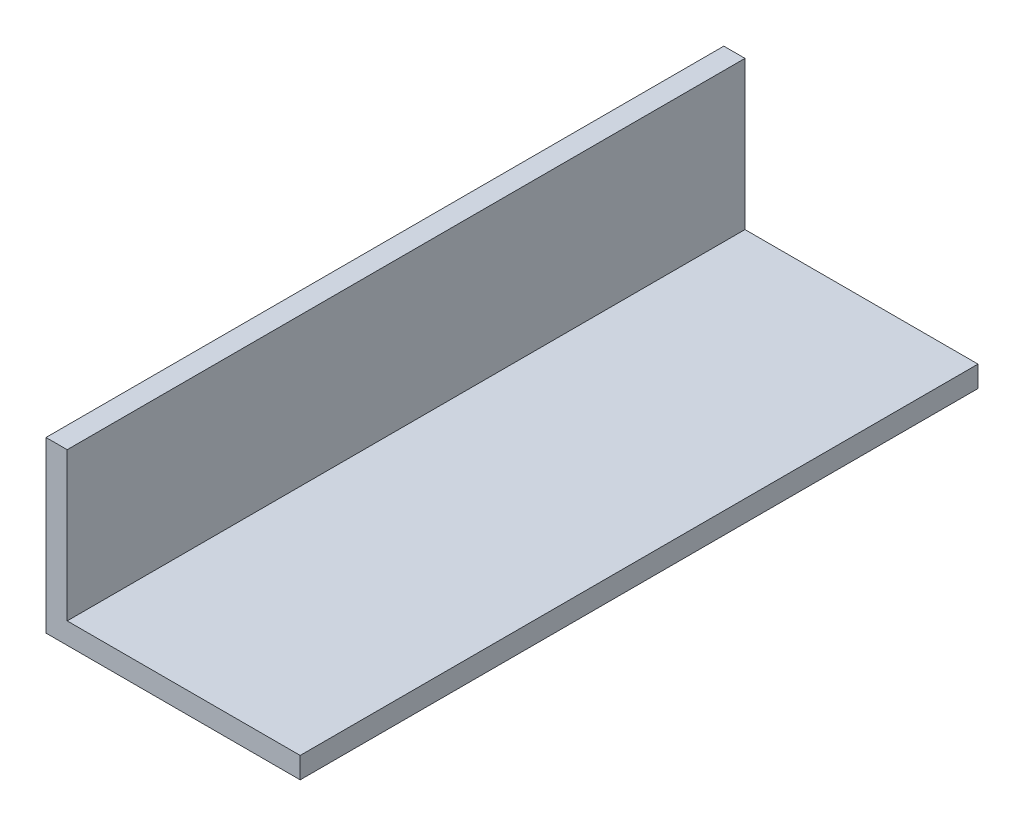
ISO-10303-21;
HEADER;
FILE_DESCRIPTION(('STEP AP214'),'2;1');
FILE_NAME('part.step','',(''),(''),'','','');
FILE_SCHEMA(('AUTOMOTIVE_DESIGN { 1 0 10303 214 1 1 1 1 }'));
ENDSEC;
DATA;
#1=APPLICATION_CONTEXT('core data for automotive mechanical design processes');
#2=APPLICATION_PROTOCOL_DEFINITION('international standard','automotive_design',2000,#1);
#3=PRODUCT_CONTEXT('',#1,'mechanical');
#4=PRODUCT('Part','Part','',(#3));
#5=PRODUCT_RELATED_PRODUCT_CATEGORY('part','',(#4));
#6=PRODUCT_DEFINITION_FORMATION('','',#4);
#7=PRODUCT_DEFINITION_CONTEXT('part definition',#1,'design');
#8=PRODUCT_DEFINITION('design','',#6,#7);
#9=PRODUCT_DEFINITION_SHAPE('','',#8);
#10=(LENGTH_UNIT() NAMED_UNIT(*) SI_UNIT(.MILLI.,.METRE.));
#11=(NAMED_UNIT(*) PLANE_ANGLE_UNIT() SI_UNIT($,.RADIAN.));
#12=(NAMED_UNIT(*) SI_UNIT($,.STERADIAN.) SOLID_ANGLE_UNIT());
#13=UNCERTAINTY_MEASURE_WITH_UNIT(LENGTH_MEASURE(1.E-05),#10,'distance_accuracy_value','');
#14=(GEOMETRIC_REPRESENTATION_CONTEXT(3) GLOBAL_UNCERTAINTY_ASSIGNED_CONTEXT((#13)) GLOBAL_UNIT_ASSIGNED_CONTEXT((#10,
#11,#12)) REPRESENTATION_CONTEXT('',''));
#15=CARTESIAN_POINT('',(0.,0.,0.));
#16=DIRECTION('',(0.,0.,1.));
#17=DIRECTION('',(1.,0.,0.));
#18=AXIS2_PLACEMENT_3D('',#15,#16,#17);
#19=CARTESIAN_POINT('',(0.,12.7,50.8));
#20=DIRECTION('',(1.,0.,0.));
#21=DIRECTION('',(0.,1.,0.));
#22=AXIS2_PLACEMENT_3D('',#19,#20,#21);
#23=PLANE('',#22);
#24=DIRECTION('',(0.,-1.,0.));
#25=VECTOR('',#24,1.);
#26=CARTESIAN_POINT('',(0.,12.7,0.));
#27=LINE('',#26,#25);
#28=CARTESIAN_POINT('',(0.,12.7,0.));
#29=VERTEX_POINT('',#28);
#30=CARTESIAN_POINT('',(0.,0.,0.));
#31=VERTEX_POINT('',#30);
#32=EDGE_CURVE('E117',#29,#31,#27,.T.);
#33=ORIENTED_EDGE('',*,*,#32,.T.);
#34=DIRECTION('',(0.,0.,-1.));
#35=VECTOR('',#34,1.);
#36=CARTESIAN_POINT('',(0.,0.,50.8));
#37=LINE('',#36,#35);
#38=CARTESIAN_POINT('',(0.,0.,50.8));
#39=VERTEX_POINT('',#38);
#40=EDGE_CURVE('E11',#39,#31,#37,.T.);
#41=ORIENTED_EDGE('',*,*,#40,.F.);
#42=DIRECTION('',(0.,-1.,0.));
#43=VECTOR('',#42,1.);
#44=CARTESIAN_POINT('',(0.,12.7,50.8));
#45=LINE('',#44,#43);
#46=CARTESIAN_POINT('',(0.,12.7,50.8));
#47=VERTEX_POINT('',#46);
#48=EDGE_CURVE('E127',#47,#39,#45,.T.);
#49=ORIENTED_EDGE('',*,*,#48,.F.);
#50=DIRECTION('',(0.,0.,-1.));
#51=VECTOR('',#50,1.);
#52=CARTESIAN_POINT('',(0.,12.7,50.8));
#53=LINE('',#52,#51);
#54=EDGE_CURVE('E113',#47,#29,#53,.T.);
#55=ORIENTED_EDGE('',*,*,#54,.T.);
#56=EDGE_LOOP('',(#33,#41,#49,#55));
#57=FACE_BOUND('',#56,.T.);
#58=ADVANCED_FACE('F33',(#57),#23,.F.);
#59=CARTESIAN_POINT('',(0.,0.,50.8));
#60=DIRECTION('',(0.,1.,0.));
#61=DIRECTION('',(0.,0.,1.));
#62=AXIS2_PLACEMENT_3D('',#59,#60,#61);
#63=PLANE('',#62);
#64=DIRECTION('',(1.,0.,0.));
#65=VECTOR('',#64,1.);
#66=CARTESIAN_POINT('',(0.,0.,0.));
#67=LINE('',#66,#65);
#68=CARTESIAN_POINT('',(19.05,0.,0.));
#69=VERTEX_POINT('',#68);
#70=EDGE_CURVE('E120',#31,#69,#67,.T.);
#71=ORIENTED_EDGE('',*,*,#70,.T.);
#72=DIRECTION('',(0.,0.,-1.));
#73=VECTOR('',#72,1.);
#74=CARTESIAN_POINT('',(19.05,0.,50.8));
#75=LINE('',#74,#73);
#76=CARTESIAN_POINT('',(19.05,0.,50.8));
#77=VERTEX_POINT('',#76);
#78=EDGE_CURVE('E41',#77,#69,#75,.T.);
#79=ORIENTED_EDGE('',*,*,#78,.F.);
#80=DIRECTION('',(1.,0.,0.));
#81=VECTOR('',#80,1.);
#82=CARTESIAN_POINT('',(0.,0.,50.8));
#83=LINE('',#82,#81);
#84=EDGE_CURVE('E86',#39,#77,#83,.T.);
#85=ORIENTED_EDGE('',*,*,#84,.F.);
#86=ORIENTED_EDGE('',*,*,#40,.T.);
#87=EDGE_LOOP('',(#71,#79,#85,#86));
#88=FACE_BOUND('',#87,.T.);
#89=ADVANCED_FACE('F151',(#88),#63,.F.);
#90=CARTESIAN_POINT('',(19.05,0.,50.8));
#91=DIRECTION('',(-1.,0.,0.));
#92=DIRECTION('',(0.,0.,1.));
#93=AXIS2_PLACEMENT_3D('',#90,#91,#92);
#94=PLANE('',#93);
#95=DIRECTION('',(0.,1.,0.));
#96=VECTOR('',#95,1.);
#97=CARTESIAN_POINT('',(19.05,0.,0.));
#98=LINE('',#97,#96);
#99=CARTESIAN_POINT('',(19.05,1.5875,0.));
#100=VERTEX_POINT('',#99);
#101=EDGE_CURVE('E122',#69,#100,#98,.T.);
#102=ORIENTED_EDGE('',*,*,#101,.T.);
#103=DIRECTION('',(0.,0.,-1.));
#104=VECTOR('',#103,1.);
#105=CARTESIAN_POINT('',(19.05,1.5875,50.8));
#106=LINE('',#105,#104);
#107=CARTESIAN_POINT('',(19.05,1.5875,50.8));
#108=VERTEX_POINT('',#107);
#109=EDGE_CURVE('E108',#108,#100,#106,.T.);
#110=ORIENTED_EDGE('',*,*,#109,.F.);
#111=DIRECTION('',(0.,1.,0.));
#112=VECTOR('',#111,1.);
#113=CARTESIAN_POINT('',(19.05,0.,50.8));
#114=LINE('',#113,#112);
#115=EDGE_CURVE('E99',#77,#108,#114,.T.);
#116=ORIENTED_EDGE('',*,*,#115,.F.);
#117=ORIENTED_EDGE('',*,*,#78,.T.);
#118=EDGE_LOOP('',(#102,#110,#116,#117));
#119=FACE_BOUND('',#118,.T.);
#120=ADVANCED_FACE('F133',(#119),#94,.F.);
#121=CARTESIAN_POINT('',(19.05,1.5875,50.8));
#122=DIRECTION('',(0.,-1.,0.));
#123=DIRECTION('',(1.,0.,0.));
#124=AXIS2_PLACEMENT_3D('',#121,#122,#123);
#125=PLANE('',#124);
#126=DIRECTION('',(-1.,0.,0.));
#127=VECTOR('',#126,1.);
#128=CARTESIAN_POINT('',(19.05,1.5875,0.));
#129=LINE('',#128,#127);
#130=CARTESIAN_POINT('',(1.5875,1.5875,0.));
#131=VERTEX_POINT('',#130);
#132=EDGE_CURVE('E107',#100,#131,#129,.T.);
#133=ORIENTED_EDGE('',*,*,#132,.T.);
#134=DIRECTION('',(0.,0.,-1.));
#135=VECTOR('',#134,1.);
#136=CARTESIAN_POINT('',(1.5875,1.5875,50.8));
#137=LINE('',#136,#135);
#138=CARTESIAN_POINT('',(1.5875,1.5875,50.8));
#139=VERTEX_POINT('',#138);
#140=EDGE_CURVE('E104',#139,#131,#137,.T.);
#141=ORIENTED_EDGE('',*,*,#140,.F.);
#142=DIRECTION('',(-1.,0.,0.));
#143=VECTOR('',#142,1.);
#144=CARTESIAN_POINT('',(19.05,1.5875,50.8));
#145=LINE('',#144,#143);
#146=EDGE_CURVE('E93',#108,#139,#145,.T.);
#147=ORIENTED_EDGE('',*,*,#146,.F.);
#148=ORIENTED_EDGE('',*,*,#109,.T.);
#149=EDGE_LOOP('',(#133,#141,#147,#148));
#150=FACE_BOUND('',#149,.T.);
#151=ADVANCED_FACE('F105',(#150),#125,.F.);
#152=CARTESIAN_POINT('',(1.5875,1.5875,50.8));
#153=DIRECTION('',(-1.,0.,0.));
#154=DIRECTION('',(0.,-1.,0.));
#155=AXIS2_PLACEMENT_3D('',#152,#153,#154);
#156=PLANE('',#155);
#157=DIRECTION('',(0.,1.,0.));
#158=VECTOR('',#157,1.);
#159=CARTESIAN_POINT('',(1.5875,1.5875,0.));
#160=LINE('',#159,#158);
#161=CARTESIAN_POINT('',(1.5875,12.7,0.));
#162=VERTEX_POINT('',#161);
#163=EDGE_CURVE('E72',#131,#162,#160,.T.);
#164=ORIENTED_EDGE('',*,*,#163,.T.);
#165=DIRECTION('',(0.,0.,-1.));
#166=VECTOR('',#165,1.);
#167=CARTESIAN_POINT('',(1.5875,12.7,50.8));
#168=LINE('',#167,#166);
#169=CARTESIAN_POINT('',(1.5875,12.7,50.8));
#170=VERTEX_POINT('',#169);
#171=EDGE_CURVE('E109',#170,#162,#168,.T.);
#172=ORIENTED_EDGE('',*,*,#171,.F.);
#173=DIRECTION('',(0.,1.,0.));
#174=VECTOR('',#173,1.);
#175=CARTESIAN_POINT('',(1.5875,1.5875,50.8));
#176=LINE('',#175,#174);
#177=EDGE_CURVE('E97',#139,#170,#176,.T.);
#178=ORIENTED_EDGE('',*,*,#177,.F.);
#179=ORIENTED_EDGE('',*,*,#140,.T.);
#180=EDGE_LOOP('',(#164,#172,#178,#179));
#181=FACE_BOUND('',#180,.T.);
#182=ADVANCED_FACE('F111',(#181),#156,.F.);
#183=CARTESIAN_POINT('',(1.5875,12.7,50.8));
#184=DIRECTION('',(0.,-1.,0.));
#185=DIRECTION('',(0.,0.,-1.));
#186=AXIS2_PLACEMENT_3D('',#183,#184,#185);
#187=PLANE('',#186);
#188=DIRECTION('',(-1.,0.,0.));
#189=VECTOR('',#188,1.);
#190=CARTESIAN_POINT('',(1.5875,12.7,0.));
#191=LINE('',#190,#189);
#192=EDGE_CURVE('E78',#162,#29,#191,.T.);
#193=ORIENTED_EDGE('',*,*,#192,.T.);
#194=ORIENTED_EDGE('',*,*,#54,.F.);
#195=DIRECTION('',(-1.,0.,0.));
#196=VECTOR('',#195,1.);
#197=CARTESIAN_POINT('',(1.5875,12.7,50.8));
#198=LINE('',#197,#196);
#199=EDGE_CURVE('E49',#170,#47,#198,.T.);
#200=ORIENTED_EDGE('',*,*,#199,.F.);
#201=ORIENTED_EDGE('',*,*,#171,.T.);
#202=EDGE_LOOP('',(#193,#194,#200,#201));
#203=FACE_BOUND('',#202,.T.);
#204=ADVANCED_FACE('F140',(#203),#187,.F.);
#205=CARTESIAN_POINT('',(0.,0.,50.8));
#206=DIRECTION('',(0.,0.,1.));
#207=DIRECTION('',(1.,0.,0.));
#208=AXIS2_PLACEMENT_3D('',#205,#206,#207);
#209=PLANE('',#208);
#210=ORIENTED_EDGE('',*,*,#48,.T.);
#211=ORIENTED_EDGE('',*,*,#84,.T.);
#212=ORIENTED_EDGE('',*,*,#115,.T.);
#213=ORIENTED_EDGE('',*,*,#146,.T.);
#214=ORIENTED_EDGE('',*,*,#177,.T.);
#215=ORIENTED_EDGE('',*,*,#199,.T.);
#216=EDGE_LOOP('',(#210,#211,#212,#213,#214,#215));
#217=FACE_BOUND('',#216,.T.);
#218=ADVANCED_FACE('F95',(#217),#209,.T.);
#219=CARTESIAN_POINT('',(0.,0.,0.));
#220=DIRECTION('',(0.,0.,1.));
#221=DIRECTION('',(1.,0.,0.));
#222=AXIS2_PLACEMENT_3D('',#219,#220,#221);
#223=PLANE('',#222);
#224=ORIENTED_EDGE('',*,*,#32,.F.);
#225=ORIENTED_EDGE('',*,*,#192,.F.);
#226=ORIENTED_EDGE('',*,*,#163,.F.);
#227=ORIENTED_EDGE('',*,*,#132,.F.);
#228=ORIENTED_EDGE('',*,*,#101,.F.);
#229=ORIENTED_EDGE('',*,*,#70,.F.);
#230=EDGE_LOOP('',(#224,#225,#226,#227,#228,#229));
#231=FACE_BOUND('',#230,.T.);
#232=ADVANCED_FACE('F136',(#231),#223,.F.);
#233=CLOSED_SHELL('',(#58,#89,#120,#151,#182,#204,#218,#232));
#234=MANIFOLD_SOLID_BREP('B2',#233);
#235=ADVANCED_BREP_SHAPE_REPRESENTATION('',(#18,#234),#14);
#236=SHAPE_DEFINITION_REPRESENTATION(#9,#235);
ENDSEC;
END-ISO-10303-21;
